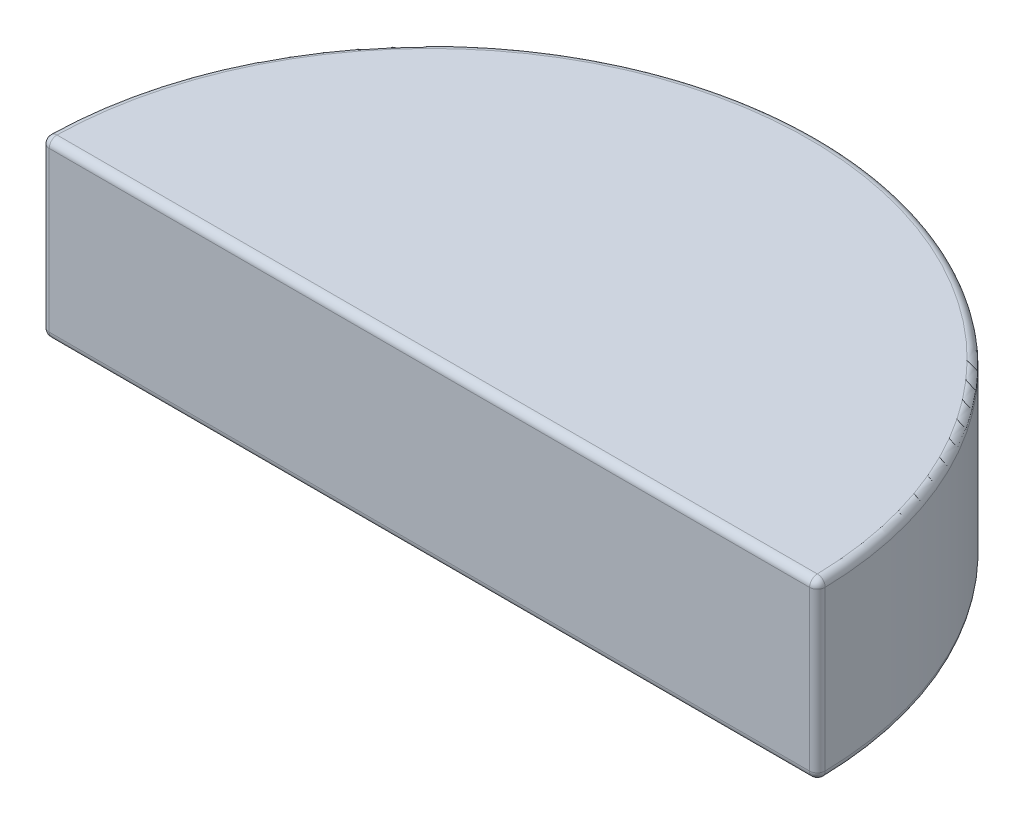
ISO-10303-21;
HEADER;
FILE_DESCRIPTION(('STEP AP214'),'2;1');
FILE_NAME('part.step','',(''),(''),'','','');
FILE_SCHEMA(('AUTOMOTIVE_DESIGN { 1 0 10303 214 1 1 1 1 }'));
ENDSEC;
DATA;
#1=APPLICATION_CONTEXT('core data for automotive mechanical design processes');
#2=APPLICATION_PROTOCOL_DEFINITION('international standard','automotive_design',2000,#1);
#3=PRODUCT_CONTEXT('',#1,'mechanical');
#4=PRODUCT('Part','Part','',(#3));
#5=PRODUCT_RELATED_PRODUCT_CATEGORY('part','',(#4));
#6=PRODUCT_DEFINITION_FORMATION('','',#4);
#7=PRODUCT_DEFINITION_CONTEXT('part definition',#1,'design');
#8=PRODUCT_DEFINITION('design','',#6,#7);
#9=PRODUCT_DEFINITION_SHAPE('','',#8);
#10=(LENGTH_UNIT() NAMED_UNIT(*) SI_UNIT(.MILLI.,.METRE.));
#11=(NAMED_UNIT(*) PLANE_ANGLE_UNIT() SI_UNIT($,.RADIAN.));
#12=(NAMED_UNIT(*) SI_UNIT($,.STERADIAN.) SOLID_ANGLE_UNIT());
#13=UNCERTAINTY_MEASURE_WITH_UNIT(LENGTH_MEASURE(1.E-05),#10,'distance_accuracy_value','');
#14=(GEOMETRIC_REPRESENTATION_CONTEXT(3) GLOBAL_UNCERTAINTY_ASSIGNED_CONTEXT((#13)) GLOBAL_UNIT_ASSIGNED_CONTEXT((#10,
#11,#12)) REPRESENTATION_CONTEXT('',''));
#15=CARTESIAN_POINT('',(0.,0.,0.));
#16=DIRECTION('',(0.,0.,1.));
#17=DIRECTION('',(1.,0.,0.));
#18=AXIS2_PLACEMENT_3D('',#15,#16,#17);
#19=CARTESIAN_POINT('',(500.,225.,0.));
#20=DIRECTION('',(0.,-1.,0.));
#21=DIRECTION('',(0.,0.,-1.));
#22=AXIS2_PLACEMENT_3D('',#19,#20,#21);
#23=CYLINDRICAL_SURFACE('',#22,500.);
#24=DIRECTION('',(0.,-1.,0.));
#25=VECTOR('',#24,1.);
#26=CARTESIAN_POINT('',(999.895865874118,225.,-10.2040816326531));
#27=LINE('',#26,#25);
#28=CARTESIAN_POINT('',(999.895865874118,215.,-10.2040816326531));
#29=VERTEX_POINT('',#28);
#30=CARTESIAN_POINT('',(999.895865874118,10.,-10.2040816326531));
#31=VERTEX_POINT('',#30);
#32=EDGE_CURVE('E110',#29,#31,#27,.T.);
#33=ORIENTED_EDGE('',*,*,#32,.T.);
#34=CARTESIAN_POINT('',(500.,10.,0.));
#35=DIRECTION('',(0.,1.,0.));
#36=DIRECTION('',(0.,0.,1.));
#37=AXIS2_PLACEMENT_3D('',#34,#35,#36);
#38=CIRCLE('',#37,500.);
#39=CARTESIAN_POINT('',(0.104134125882028,10.,-10.2040816326531));
#40=VERTEX_POINT('',#39);
#41=EDGE_CURVE('E142',#31,#40,#38,.T.);
#42=ORIENTED_EDGE('',*,*,#41,.T.);
#43=DIRECTION('',(0.,-1.,0.));
#44=VECTOR('',#43,1.);
#45=CARTESIAN_POINT('',(0.104134125882005,225.,-10.2040816326531));
#46=LINE('',#45,#44);
#47=CARTESIAN_POINT('',(0.104134125882028,215.,-10.2040816326531));
#48=VERTEX_POINT('',#47);
#49=EDGE_CURVE('E138',#40,#48,#46,.F.);
#50=ORIENTED_EDGE('',*,*,#49,.T.);
#51=CARTESIAN_POINT('',(500.,215.,0.));
#52=DIRECTION('',(0.,1.,0.));
#53=DIRECTION('',(0.,0.,1.));
#54=AXIS2_PLACEMENT_3D('',#51,#52,#53);
#55=CIRCLE('',#54,500.);
#56=EDGE_CURVE('E133',#48,#29,#55,.F.);
#57=ORIENTED_EDGE('',*,*,#56,.T.);
#58=EDGE_LOOP('',(#33,#42,#50,#57));
#59=FACE_BOUND('',#58,.T.);
#60=ADVANCED_FACE('F39',(#59),#23,.T.);
#61=CARTESIAN_POINT('',(0.,225.,0.));
#62=DIRECTION('',(0.,0.,-1.));
#63=DIRECTION('',(-1.,0.,0.));
#64=AXIS2_PLACEMENT_3D('',#61,#62,#63);
#65=PLANE('',#64);
#66=DIRECTION('',(0.,-1.,0.));
#67=VECTOR('',#66,1.);
#68=CARTESIAN_POINT('',(10.1020514433644,225.,0.));
#69=LINE('',#68,#67);
#70=CARTESIAN_POINT('',(10.1020514433644,215.,0.));
#71=VERTEX_POINT('',#70);
#72=CARTESIAN_POINT('',(10.1020514433644,10.,0.));
#73=VERTEX_POINT('',#72);
#74=EDGE_CURVE('E105',#71,#73,#69,.T.);
#75=ORIENTED_EDGE('',*,*,#74,.T.);
#76=DIRECTION('',(1.,0.,0.));
#77=VECTOR('',#76,1.);
#78=CARTESIAN_POINT('',(0.,10.,0.));
#79=LINE('',#78,#77);
#80=CARTESIAN_POINT('',(989.897948556636,10.,0.));
#81=VERTEX_POINT('',#80);
#82=EDGE_CURVE('E100',#73,#81,#79,.T.);
#83=ORIENTED_EDGE('',*,*,#82,.T.);
#84=DIRECTION('',(0.,-1.,0.));
#85=VECTOR('',#84,1.);
#86=CARTESIAN_POINT('',(989.897948556636,225.,0.));
#87=LINE('',#86,#85);
#88=CARTESIAN_POINT('',(989.897948556636,215.,0.));
#89=VERTEX_POINT('',#88);
#90=EDGE_CURVE('E92',#81,#89,#87,.F.);
#91=ORIENTED_EDGE('',*,*,#90,.T.);
#92=DIRECTION('',(1.,0.,0.));
#93=VECTOR('',#92,1.);
#94=CARTESIAN_POINT('',(0.,215.,0.));
#95=LINE('',#94,#93);
#96=EDGE_CURVE('E97',#89,#71,#95,.F.);
#97=ORIENTED_EDGE('',*,*,#96,.T.);
#98=EDGE_LOOP('',(#75,#83,#91,#97));
#99=FACE_BOUND('',#98,.T.);
#100=ADVANCED_FACE('F95',(#99),#65,.F.);
#101=CARTESIAN_POINT('',(500.,225.,0.));
#102=DIRECTION('',(0.,1.,0.));
#103=DIRECTION('',(0.,0.,1.));
#104=AXIS2_PLACEMENT_3D('',#101,#102,#103);
#105=PLANE('',#104);
#106=CARTESIAN_POINT('',(500.,225.,0.));
#107=DIRECTION('',(0.,1.,0.));
#108=DIRECTION('',(0.,0.,1.));
#109=AXIS2_PLACEMENT_3D('',#106,#107,#108);
#110=CIRCLE('',#109,490.);
#111=CARTESIAN_POINT('',(989.897948556636,225.,-10.));
#112=VERTEX_POINT('',#111);
#113=CARTESIAN_POINT('',(10.1020514433644,225.,-10.));
#114=VERTEX_POINT('',#113);
#115=EDGE_CURVE('E49',#112,#114,#110,.T.);
#116=ORIENTED_EDGE('',*,*,#115,.T.);
#117=DIRECTION('',(1.,0.,0.));
#118=VECTOR('',#117,1.);
#119=CARTESIAN_POINT('',(1000.,225.,-10.));
#120=LINE('',#119,#118);
#121=EDGE_CURVE('E11',#114,#112,#120,.T.);
#122=ORIENTED_EDGE('',*,*,#121,.T.);
#123=EDGE_LOOP('',(#116,#122));
#124=FACE_BOUND('',#123,.T.);
#125=ADVANCED_FACE('F222',(#124),#105,.T.);
#126=CARTESIAN_POINT('',(500.,0.,0.));
#127=DIRECTION('',(0.,1.,0.));
#128=DIRECTION('',(0.,0.,1.));
#129=AXIS2_PLACEMENT_3D('',#126,#127,#128);
#130=PLANE('',#129);
#131=CARTESIAN_POINT('',(500.,0.,0.));
#132=DIRECTION('',(0.,1.,0.));
#133=DIRECTION('',(0.,0.,1.));
#134=AXIS2_PLACEMENT_3D('',#131,#132,#133);
#135=CIRCLE('',#134,490.);
#136=CARTESIAN_POINT('',(10.1020514433644,0.,-10.));
#137=VERTEX_POINT('',#136);
#138=CARTESIAN_POINT('',(989.897948556636,0.,-10.));
#139=VERTEX_POINT('',#138);
#140=EDGE_CURVE('E145',#137,#139,#135,.F.);
#141=ORIENTED_EDGE('',*,*,#140,.T.);
#142=DIRECTION('',(1.,0.,0.));
#143=VECTOR('',#142,1.);
#144=CARTESIAN_POINT('',(500.,0.,-10.));
#145=LINE('',#144,#143);
#146=EDGE_CURVE('E148',#139,#137,#145,.F.);
#147=ORIENTED_EDGE('',*,*,#146,.T.);
#148=EDGE_LOOP('',(#141,#147));
#149=FACE_BOUND('',#148,.T.);
#150=ADVANCED_FACE('F193',(#149),#130,.F.);
#151=CARTESIAN_POINT('',(989.897948556636,225.,-10.));
#152=DIRECTION('',(0.,-1.,0.));
#153=DIRECTION('',(0.,0.,-1.));
#154=AXIS2_PLACEMENT_3D('',#151,#152,#153);
#155=CYLINDRICAL_SURFACE('',#154,10.);
#156=CARTESIAN_POINT('',(989.897948556636,215.,-10.));
#157=DIRECTION('',(0.,1.,0.));
#158=DIRECTION('',(0.,0.,1.));
#159=AXIS2_PLACEMENT_3D('',#156,#157,#158);
#160=CIRCLE('',#159,10.);
#161=EDGE_CURVE('E43',#89,#29,#160,.T.);
#162=ORIENTED_EDGE('',*,*,#161,.F.);
#163=ORIENTED_EDGE('',*,*,#90,.F.);
#164=CARTESIAN_POINT('',(989.897948556636,10.,-10.));
#165=DIRECTION('',(0.,-1.,0.));
#166=DIRECTION('',(0.,0.,-1.));
#167=AXIS2_PLACEMENT_3D('',#164,#165,#166);
#168=CIRCLE('',#167,10.);
#169=EDGE_CURVE('E113',#31,#81,#168,.T.);
#170=ORIENTED_EDGE('',*,*,#169,.F.);
#171=ORIENTED_EDGE('',*,*,#32,.F.);
#172=EDGE_LOOP('',(#162,#163,#170,#171));
#173=FACE_BOUND('',#172,.T.);
#174=ADVANCED_FACE('F41',(#173),#155,.T.);
#175=CARTESIAN_POINT('',(989.897948556636,215.,-10.));
#176=DIRECTION('',(0.,0.,1.));
#177=DIRECTION('',(1.,0.,0.));
#178=AXIS2_PLACEMENT_3D('',#175,#176,#177);
#179=SPHERICAL_SURFACE('',#178,10.);
#180=CARTESIAN_POINT('',(989.897948556636,215.,-10.));
#181=DIRECTION('',(1.,0.,0.));
#182=DIRECTION('',(0.,0.,-1.));
#183=AXIS2_PLACEMENT_3D('',#180,#181,#182);
#184=CIRCLE('',#183,10.);
#185=EDGE_CURVE('E115',#89,#112,#184,.F.);
#186=ORIENTED_EDGE('',*,*,#185,.F.);
#187=ORIENTED_EDGE('',*,*,#161,.T.);
#188=CARTESIAN_POINT('',(989.897948556636,215.,-10.));
#189=DIRECTION('',(0.0204081632653062,0.,0.999791731748236));
#190=DIRECTION('',(0.999791731748236,0.,-0.0204081632653062));
#191=AXIS2_PLACEMENT_3D('',#188,#189,#190);
#192=CIRCLE('',#191,10.);
#193=EDGE_CURVE('E117',#112,#29,#192,.F.);
#194=ORIENTED_EDGE('',*,*,#193,.F.);
#195=EDGE_LOOP('',(#186,#187,#194));
#196=FACE_BOUND('',#195,.T.);
#197=ADVANCED_FACE('F116',(#196),#179,.T.);
#198=CARTESIAN_POINT('',(989.897948556636,10.,-10.));
#199=DIRECTION('',(0.,0.,1.));
#200=DIRECTION('',(1.,0.,0.));
#201=AXIS2_PLACEMENT_3D('',#198,#199,#200);
#202=SPHERICAL_SURFACE('',#201,10.);
#203=CARTESIAN_POINT('',(989.897948556636,10.,-10.));
#204=DIRECTION('',(0.0204081632653062,0.,0.999791731748236));
#205=DIRECTION('',(0.999791731748236,0.,-0.0204081632653062));
#206=AXIS2_PLACEMENT_3D('',#203,#204,#205);
#207=CIRCLE('',#206,10.);
#208=EDGE_CURVE('E173',#31,#139,#207,.F.);
#209=ORIENTED_EDGE('',*,*,#208,.F.);
#210=ORIENTED_EDGE('',*,*,#169,.T.);
#211=CARTESIAN_POINT('',(989.897948556636,10.,-10.));
#212=DIRECTION('',(1.,0.,0.));
#213=DIRECTION('',(0.,0.,-1.));
#214=AXIS2_PLACEMENT_3D('',#211,#212,#213);
#215=CIRCLE('',#214,10.);
#216=EDGE_CURVE('E120',#139,#81,#215,.F.);
#217=ORIENTED_EDGE('',*,*,#216,.F.);
#218=EDGE_LOOP('',(#209,#210,#217));
#219=FACE_BOUND('',#218,.T.);
#220=ADVANCED_FACE('F185',(#219),#202,.T.);
#221=CARTESIAN_POINT('',(500.,215.,0.));
#222=DIRECTION('',(0.,1.,0.));
#223=DIRECTION('',(0.,0.,1.));
#224=AXIS2_PLACEMENT_3D('',#221,#222,#223);
#225=TOROIDAL_SURFACE('',#224,490.,10.);
#226=ORIENTED_EDGE('',*,*,#193,.T.);
#227=ORIENTED_EDGE('',*,*,#56,.F.);
#228=CARTESIAN_POINT('',(10.1020514433644,215.,-10.));
#229=DIRECTION('',(-0.0204081632653062,0.,0.999791731748236));
#230=DIRECTION('',(0.999791731748236,0.,0.0204081632653062));
#231=AXIS2_PLACEMENT_3D('',#228,#229,#230);
#232=CIRCLE('',#231,10.);
#233=EDGE_CURVE('E169',#114,#48,#232,.T.);
#234=ORIENTED_EDGE('',*,*,#233,.F.);
#235=ORIENTED_EDGE('',*,*,#115,.F.);
#236=EDGE_LOOP('',(#226,#227,#234,#235));
#237=FACE_BOUND('',#236,.T.);
#238=ADVANCED_FACE('F200',(#237),#225,.T.);
#239=CARTESIAN_POINT('',(500.,215.,-10.));
#240=DIRECTION('',(-1.,0.,0.));
#241=DIRECTION('',(0.,0.,1.));
#242=AXIS2_PLACEMENT_3D('',#239,#240,#241);
#243=CYLINDRICAL_SURFACE('',#242,10.);
#244=ORIENTED_EDGE('',*,*,#185,.T.);
#245=ORIENTED_EDGE('',*,*,#121,.F.);
#246=CARTESIAN_POINT('',(10.1020514433644,215.,-10.));
#247=DIRECTION('',(-1.,0.,0.));
#248=DIRECTION('',(0.,-1.,0.));
#249=AXIS2_PLACEMENT_3D('',#246,#247,#248);
#250=CIRCLE('',#249,10.);
#251=EDGE_CURVE('E124',#71,#114,#250,.T.);
#252=ORIENTED_EDGE('',*,*,#251,.F.);
#253=ORIENTED_EDGE('',*,*,#96,.F.);
#254=EDGE_LOOP('',(#244,#245,#252,#253));
#255=FACE_BOUND('',#254,.T.);
#256=ADVANCED_FACE('F122',(#255),#243,.T.);
#257=CARTESIAN_POINT('',(0.,10.,-10.));
#258=DIRECTION('',(1.,0.,0.));
#259=DIRECTION('',(0.,0.,-1.));
#260=AXIS2_PLACEMENT_3D('',#257,#258,#259);
#261=CYLINDRICAL_SURFACE('',#260,10.);
#262=ORIENTED_EDGE('',*,*,#216,.T.);
#263=ORIENTED_EDGE('',*,*,#82,.F.);
#264=CARTESIAN_POINT('',(10.1020514433644,10.,-10.));
#265=DIRECTION('',(-1.,0.,0.));
#266=DIRECTION('',(0.,0.,1.));
#267=AXIS2_PLACEMENT_3D('',#264,#265,#266);
#268=CIRCLE('',#267,10.);
#269=EDGE_CURVE('E163',#137,#73,#268,.T.);
#270=ORIENTED_EDGE('',*,*,#269,.F.);
#271=ORIENTED_EDGE('',*,*,#146,.F.);
#272=EDGE_LOOP('',(#262,#263,#270,#271));
#273=FACE_BOUND('',#272,.T.);
#274=ADVANCED_FACE('F189',(#273),#261,.T.);
#275=CARTESIAN_POINT('',(500.,10.,0.));
#276=DIRECTION('',(0.,1.,0.));
#277=DIRECTION('',(0.,0.,1.));
#278=AXIS2_PLACEMENT_3D('',#275,#276,#277);
#279=TOROIDAL_SURFACE('',#278,490.,10.);
#280=ORIENTED_EDGE('',*,*,#208,.T.);
#281=ORIENTED_EDGE('',*,*,#140,.F.);
#282=CARTESIAN_POINT('',(10.1020514433644,10.,-10.));
#283=DIRECTION('',(-0.0204081632653062,0.,0.999791731748236));
#284=DIRECTION('',(0.999791731748236,0.,0.0204081632653062));
#285=AXIS2_PLACEMENT_3D('',#282,#283,#284);
#286=CIRCLE('',#285,10.);
#287=EDGE_CURVE('E160',#40,#137,#286,.T.);
#288=ORIENTED_EDGE('',*,*,#287,.F.);
#289=ORIENTED_EDGE('',*,*,#41,.F.);
#290=EDGE_LOOP('',(#280,#281,#288,#289));
#291=FACE_BOUND('',#290,.T.);
#292=ADVANCED_FACE('F196',(#291),#279,.T.);
#293=CARTESIAN_POINT('',(10.1020514433644,215.,-10.));
#294=DIRECTION('',(0.,0.,1.));
#295=DIRECTION('',(1.,0.,0.));
#296=AXIS2_PLACEMENT_3D('',#293,#294,#295);
#297=SPHERICAL_SURFACE('',#296,10.);
#298=ORIENTED_EDGE('',*,*,#251,.T.);
#299=ORIENTED_EDGE('',*,*,#233,.T.);
#300=CARTESIAN_POINT('',(10.1020514433644,215.,-10.));
#301=DIRECTION('',(0.,1.,0.));
#302=DIRECTION('',(0.,0.,1.));
#303=AXIS2_PLACEMENT_3D('',#300,#301,#302);
#304=CIRCLE('',#303,10.);
#305=EDGE_CURVE('E157',#71,#48,#304,.F.);
#306=ORIENTED_EDGE('',*,*,#305,.F.);
#307=EDGE_LOOP('',(#298,#299,#306));
#308=FACE_BOUND('',#307,.T.);
#309=ADVANCED_FACE('F202',(#308),#297,.T.);
#310=CARTESIAN_POINT('',(10.1020514433644,10.,-10.));
#311=DIRECTION('',(0.,0.,1.));
#312=DIRECTION('',(1.,0.,0.));
#313=AXIS2_PLACEMENT_3D('',#310,#311,#312);
#314=SPHERICAL_SURFACE('',#313,10.);
#315=ORIENTED_EDGE('',*,*,#287,.T.);
#316=ORIENTED_EDGE('',*,*,#269,.T.);
#317=CARTESIAN_POINT('',(10.1020514433644,10.,-10.));
#318=DIRECTION('',(0.,-1.,0.));
#319=DIRECTION('',(0.,0.,-1.));
#320=AXIS2_PLACEMENT_3D('',#317,#318,#319);
#321=CIRCLE('',#320,10.);
#322=EDGE_CURVE('E154',#40,#73,#321,.F.);
#323=ORIENTED_EDGE('',*,*,#322,.F.);
#324=EDGE_LOOP('',(#315,#316,#323));
#325=FACE_BOUND('',#324,.T.);
#326=ADVANCED_FACE('F208',(#325),#314,.T.);
#327=CARTESIAN_POINT('',(10.1020514433644,225.,-10.));
#328=DIRECTION('',(0.,-1.,0.));
#329=DIRECTION('',(0.,0.,-1.));
#330=AXIS2_PLACEMENT_3D('',#327,#328,#329);
#331=CYLINDRICAL_SURFACE('',#330,10.);
#332=ORIENTED_EDGE('',*,*,#305,.T.);
#333=ORIENTED_EDGE('',*,*,#49,.F.);
#334=ORIENTED_EDGE('',*,*,#322,.T.);
#335=ORIENTED_EDGE('',*,*,#74,.F.);
#336=EDGE_LOOP('',(#332,#333,#334,#335));
#337=FACE_BOUND('',#336,.T.);
#338=ADVANCED_FACE('F205',(#337),#331,.T.);
#339=CLOSED_SHELL('',(#60,#100,#125,#150,#174,#197,#220,#238,#256,#274,#292,#309,#326,#338));
#340=MANIFOLD_SOLID_BREP('B2',#339);
#341=ADVANCED_BREP_SHAPE_REPRESENTATION('',(#18,#340),#14);
#342=SHAPE_DEFINITION_REPRESENTATION(#9,#341);
ENDSEC;
END-ISO-10303-21;
